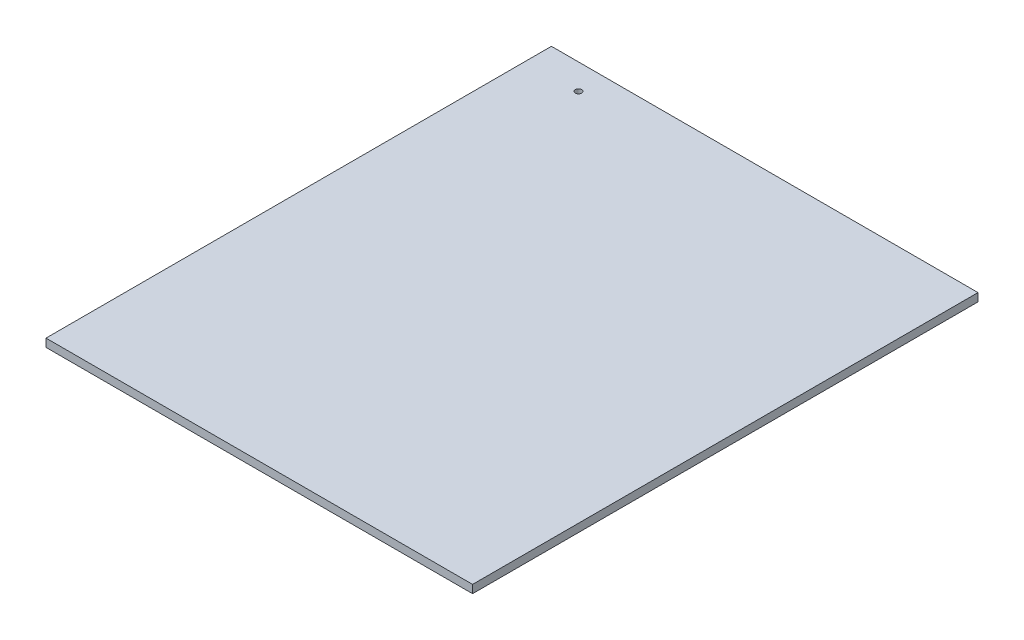
ISO-10303-21;
HEADER;
FILE_DESCRIPTION(('STEP AP214'),'2;1');
FILE_NAME('part.step','',(''),(''),'','','');
FILE_SCHEMA(('AUTOMOTIVE_DESIGN { 1 0 10303 214 1 1 1 1 }'));
ENDSEC;
DATA;
#1=APPLICATION_CONTEXT('core data for automotive mechanical design processes');
#2=APPLICATION_PROTOCOL_DEFINITION('international standard','automotive_design',2000,#1);
#3=PRODUCT_CONTEXT('',#1,'mechanical');
#4=PRODUCT('Part','Part','',(#3));
#5=PRODUCT_RELATED_PRODUCT_CATEGORY('part','',(#4));
#6=PRODUCT_DEFINITION_FORMATION('','',#4);
#7=PRODUCT_DEFINITION_CONTEXT('part definition',#1,'design');
#8=PRODUCT_DEFINITION('design','',#6,#7);
#9=PRODUCT_DEFINITION_SHAPE('','',#8);
#10=(LENGTH_UNIT() NAMED_UNIT(*) SI_UNIT(.MILLI.,.METRE.));
#11=(NAMED_UNIT(*) PLANE_ANGLE_UNIT() SI_UNIT($,.RADIAN.));
#12=(NAMED_UNIT(*) SI_UNIT($,.STERADIAN.) SOLID_ANGLE_UNIT());
#13=UNCERTAINTY_MEASURE_WITH_UNIT(LENGTH_MEASURE(1.E-05),#10,'distance_accuracy_value','');
#14=(GEOMETRIC_REPRESENTATION_CONTEXT(3) GLOBAL_UNCERTAINTY_ASSIGNED_CONTEXT((#13)) GLOBAL_UNIT_ASSIGNED_CONTEXT((#10,
#11,#12)) REPRESENTATION_CONTEXT('',''));
#15=CARTESIAN_POINT('',(0.,0.,0.));
#16=DIRECTION('',(0.,0.,1.));
#17=DIRECTION('',(1.,0.,0.));
#18=AXIS2_PLACEMENT_3D('',#15,#16,#17);
#19=CARTESIAN_POINT('',(0.,4.,0.));
#20=DIRECTION('',(0.,1.,0.));
#21=DIRECTION('',(0.,0.,1.));
#22=AXIS2_PLACEMENT_3D('',#19,#20,#21);
#23=PLANE('',#22);
#24=DIRECTION('',(0.,0.,1.));
#25=VECTOR('',#24,1.);
#26=CARTESIAN_POINT('',(-130.173203143398,4.,-20.641534167448));
#27=LINE('',#26,#25);
#28=CARTESIAN_POINT('',(-130.173203143398,4.,-20.641534167448));
#29=VERTEX_POINT('',#28);
#30=CARTESIAN_POINT('',(-130.173203143398,4.,229.358465832552));
#31=VERTEX_POINT('',#30);
#32=EDGE_CURVE('E93',#29,#31,#27,.T.);
#33=ORIENTED_EDGE('',*,*,#32,.T.);
#34=DIRECTION('',(1.,0.,0.));
#35=VECTOR('',#34,1.);
#36=CARTESIAN_POINT('',(-130.173203143398,4.,229.358465832552));
#37=LINE('',#36,#35);
#38=CARTESIAN_POINT('',(80.8267968566021,4.,229.358465832552));
#39=VERTEX_POINT('',#38);
#40=EDGE_CURVE('E88',#31,#39,#37,.T.);
#41=ORIENTED_EDGE('',*,*,#40,.T.);
#42=DIRECTION('',(0.,0.,-1.));
#43=VECTOR('',#42,1.);
#44=CARTESIAN_POINT('',(80.8267968566024,4.,-20.641534167448));
#45=LINE('',#44,#43);
#46=CARTESIAN_POINT('',(80.8267968566024,4.,-20.641534167448));
#47=VERTEX_POINT('',#46);
#48=EDGE_CURVE('E91',#39,#47,#45,.T.);
#49=ORIENTED_EDGE('',*,*,#48,.T.);
#50=DIRECTION('',(-1.,0.,0.));
#51=VECTOR('',#50,1.);
#52=CARTESIAN_POINT('',(-130.173203143398,4.,-20.641534167448));
#53=LINE('',#52,#51);
#54=EDGE_CURVE('E58',#47,#29,#53,.T.);
#55=ORIENTED_EDGE('',*,*,#54,.T.);
#56=EDGE_LOOP('',(#33,#41,#49,#55));
#57=FACE_BOUND('',#56,.T.);
#58=CARTESIAN_POINT('',(-104.173203143398,4.,-8.03125160781889));
#59=DIRECTION('',(0.,1.,0.));
#60=DIRECTION('',(0.,0.,1.));
#61=AXIS2_PLACEMENT_3D('',#58,#59,#60);
#62=CIRCLE('',#61,1.54999999999999);
#63=CARTESIAN_POINT('',(-104.173203143398,4.,-6.48125160781889));
#64=VERTEX_POINT('',#63);
#65=EDGE_CURVE('E108',#64,#64,#62,.T.);
#66=ORIENTED_EDGE('',*,*,#65,.F.);
#67=EDGE_LOOP('',(#66));
#68=FACE_BOUND('',#67,.T.);
#69=ADVANCED_FACE('F41',(#57,#68),#23,.T.);
#70=CARTESIAN_POINT('',(0.,0.,0.));
#71=DIRECTION('',(0.,1.,0.));
#72=DIRECTION('',(0.,0.,1.));
#73=AXIS2_PLACEMENT_3D('',#70,#71,#72);
#74=PLANE('',#73);
#75=DIRECTION('',(0.,0.,1.));
#76=VECTOR('',#75,1.);
#77=CARTESIAN_POINT('',(-130.173203143398,0.,-20.641534167448));
#78=LINE('',#77,#76);
#79=CARTESIAN_POINT('',(-130.173203143398,0.,-20.641534167448));
#80=VERTEX_POINT('',#79);
#81=CARTESIAN_POINT('',(-130.173203143398,0.,229.358465832552));
#82=VERTEX_POINT('',#81);
#83=EDGE_CURVE('E105',#80,#82,#78,.T.);
#84=ORIENTED_EDGE('',*,*,#83,.F.);
#85=DIRECTION('',(-1.,0.,0.));
#86=VECTOR('',#85,1.);
#87=CARTESIAN_POINT('',(-130.173203143398,0.,-20.641534167448));
#88=LINE('',#87,#86);
#89=CARTESIAN_POINT('',(80.8267968566024,0.,-20.641534167448));
#90=VERTEX_POINT('',#89);
#91=EDGE_CURVE('E81',#90,#80,#88,.T.);
#92=ORIENTED_EDGE('',*,*,#91,.F.);
#93=DIRECTION('',(0.,0.,-1.));
#94=VECTOR('',#93,1.);
#95=CARTESIAN_POINT('',(80.8267968566024,0.,-20.641534167448));
#96=LINE('',#95,#94);
#97=CARTESIAN_POINT('',(80.8267968566021,0.,229.358465832552));
#98=VERTEX_POINT('',#97);
#99=EDGE_CURVE('E75',#98,#90,#96,.T.);
#100=ORIENTED_EDGE('',*,*,#99,.F.);
#101=DIRECTION('',(1.,0.,0.));
#102=VECTOR('',#101,1.);
#103=CARTESIAN_POINT('',(-130.173203143398,0.,229.358465832552));
#104=LINE('',#103,#102);
#105=EDGE_CURVE('E97',#82,#98,#104,.T.);
#106=ORIENTED_EDGE('',*,*,#105,.F.);
#107=EDGE_LOOP('',(#84,#92,#100,#106));
#108=FACE_BOUND('',#107,.T.);
#109=CARTESIAN_POINT('',(-104.173203143398,0.,-8.03125160781889));
#110=DIRECTION('',(0.,1.,0.));
#111=DIRECTION('',(0.,0.,1.));
#112=AXIS2_PLACEMENT_3D('',#109,#110,#111);
#113=CIRCLE('',#112,1.54999999999999);
#114=CARTESIAN_POINT('',(-104.173203143398,0.,-6.48125160781889));
#115=VERTEX_POINT('',#114);
#116=EDGE_CURVE('E120',#115,#115,#113,.T.);
#117=ORIENTED_EDGE('',*,*,#116,.T.);
#118=EDGE_LOOP('',(#117));
#119=FACE_BOUND('',#118,.T.);
#120=ADVANCED_FACE('F116',(#108,#119),#74,.F.);
#121=CARTESIAN_POINT('',(-130.173203143398,4.,-20.641534167448));
#122=DIRECTION('',(1.,0.,0.));
#123=DIRECTION('',(0.,0.,-1.));
#124=AXIS2_PLACEMENT_3D('',#121,#122,#123);
#125=PLANE('',#124);
#126=ORIENTED_EDGE('',*,*,#83,.T.);
#127=DIRECTION('',(0.,-1.,0.));
#128=VECTOR('',#127,1.);
#129=CARTESIAN_POINT('',(-130.173203143398,4.,229.358465832552));
#130=LINE('',#129,#128);
#131=EDGE_CURVE('E11',#31,#82,#130,.T.);
#132=ORIENTED_EDGE('',*,*,#131,.F.);
#133=ORIENTED_EDGE('',*,*,#32,.F.);
#134=DIRECTION('',(0.,-1.,0.));
#135=VECTOR('',#134,1.);
#136=CARTESIAN_POINT('',(-130.173203143398,4.,-20.641534167448));
#137=LINE('',#136,#135);
#138=EDGE_CURVE('E101',#29,#80,#137,.T.);
#139=ORIENTED_EDGE('',*,*,#138,.T.);
#140=EDGE_LOOP('',(#126,#132,#133,#139));
#141=FACE_BOUND('',#140,.T.);
#142=ADVANCED_FACE('F43',(#141),#125,.F.);
#143=CARTESIAN_POINT('',(-130.173203143398,4.,229.358465832552));
#144=DIRECTION('',(0.,0.,-1.));
#145=DIRECTION('',(-1.,0.,0.));
#146=AXIS2_PLACEMENT_3D('',#143,#144,#145);
#147=PLANE('',#146);
#148=ORIENTED_EDGE('',*,*,#105,.T.);
#149=DIRECTION('',(0.,-1.,0.));
#150=VECTOR('',#149,1.);
#151=CARTESIAN_POINT('',(80.8267968566021,4.,229.358465832552));
#152=LINE('',#151,#150);
#153=EDGE_CURVE('E50',#39,#98,#152,.T.);
#154=ORIENTED_EDGE('',*,*,#153,.F.);
#155=ORIENTED_EDGE('',*,*,#40,.F.);
#156=ORIENTED_EDGE('',*,*,#131,.T.);
#157=EDGE_LOOP('',(#148,#154,#155,#156));
#158=FACE_BOUND('',#157,.T.);
#159=ADVANCED_FACE('F96',(#158),#147,.F.);
#160=CARTESIAN_POINT('',(80.8267968566024,4.,-20.641534167448));
#161=DIRECTION('',(-1.,0.,0.));
#162=DIRECTION('',(0.,0.,1.));
#163=AXIS2_PLACEMENT_3D('',#160,#161,#162);
#164=PLANE('',#163);
#165=ORIENTED_EDGE('',*,*,#99,.T.);
#166=DIRECTION('',(0.,-1.,0.));
#167=VECTOR('',#166,1.);
#168=CARTESIAN_POINT('',(80.8267968566024,4.,-20.641534167448));
#169=LINE('',#168,#167);
#170=EDGE_CURVE('E98',#47,#90,#169,.T.);
#171=ORIENTED_EDGE('',*,*,#170,.F.);
#172=ORIENTED_EDGE('',*,*,#48,.F.);
#173=ORIENTED_EDGE('',*,*,#153,.T.);
#174=EDGE_LOOP('',(#165,#171,#172,#173));
#175=FACE_BOUND('',#174,.T.);
#176=ADVANCED_FACE('F99',(#175),#164,.F.);
#177=CARTESIAN_POINT('',(-130.173203143398,4.,-20.641534167448));
#178=DIRECTION('',(0.,0.,1.));
#179=DIRECTION('',(1.,0.,0.));
#180=AXIS2_PLACEMENT_3D('',#177,#178,#179);
#181=PLANE('',#180);
#182=ORIENTED_EDGE('',*,*,#91,.T.);
#183=ORIENTED_EDGE('',*,*,#138,.F.);
#184=ORIENTED_EDGE('',*,*,#54,.F.);
#185=ORIENTED_EDGE('',*,*,#170,.T.);
#186=EDGE_LOOP('',(#182,#183,#184,#185));
#187=FACE_BOUND('',#186,.T.);
#188=ADVANCED_FACE('F113',(#187),#181,.F.);
#189=CARTESIAN_POINT('',(-104.173203143398,4.,-8.03125160781889));
#190=DIRECTION('',(0.,-1.,0.));
#191=DIRECTION('',(0.,0.,-1.));
#192=AXIS2_PLACEMENT_3D('',#189,#190,#191);
#193=CYLINDRICAL_SURFACE('',#192,1.54999999999999);
#194=ORIENTED_EDGE('',*,*,#65,.T.);
#195=EDGE_LOOP('',(#194));
#196=FACE_BOUND('',#195,.T.);
#197=ORIENTED_EDGE('',*,*,#116,.F.);
#198=EDGE_LOOP('',(#197));
#199=FACE_BOUND('',#198,.T.);
#200=ADVANCED_FACE('F126',(#196,#199),#193,.F.);
#201=CLOSED_SHELL('',(#69,#120,#142,#159,#176,#188,#200));
#202=MANIFOLD_SOLID_BREP('B2',#201);
#203=ADVANCED_BREP_SHAPE_REPRESENTATION('',(#18,#202),#14);
#204=SHAPE_DEFINITION_REPRESENTATION(#9,#203);
ENDSEC;
END-ISO-10303-21;
